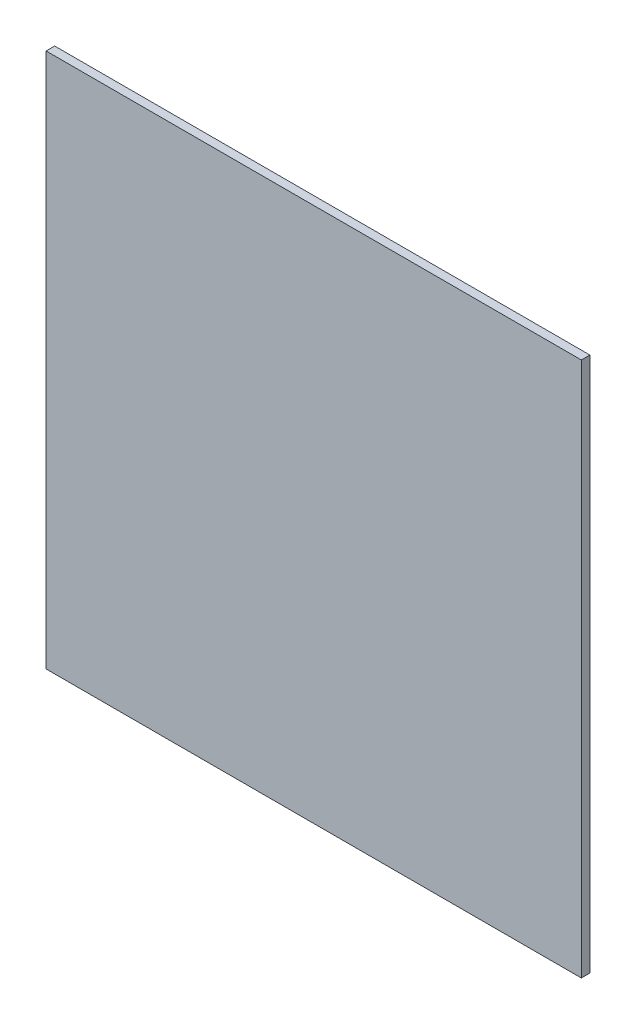
ISO-10303-21;
HEADER;
FILE_DESCRIPTION(('STEP AP214'),'2;1');
FILE_NAME('part.step','',(''),(''),'','','');
FILE_SCHEMA(('AUTOMOTIVE_DESIGN { 1 0 10303 214 1 1 1 1 }'));
ENDSEC;
DATA;
#1=APPLICATION_CONTEXT('core data for automotive mechanical design processes');
#2=APPLICATION_PROTOCOL_DEFINITION('international standard','automotive_design',2000,#1);
#3=PRODUCT_CONTEXT('',#1,'mechanical');
#4=PRODUCT('Part','Part','',(#3));
#5=PRODUCT_RELATED_PRODUCT_CATEGORY('part','',(#4));
#6=PRODUCT_DEFINITION_FORMATION('','',#4);
#7=PRODUCT_DEFINITION_CONTEXT('part definition',#1,'design');
#8=PRODUCT_DEFINITION('design','',#6,#7);
#9=PRODUCT_DEFINITION_SHAPE('','',#8);
#10=(LENGTH_UNIT() NAMED_UNIT(*) SI_UNIT(.MILLI.,.METRE.));
#11=(NAMED_UNIT(*) PLANE_ANGLE_UNIT() SI_UNIT($,.RADIAN.));
#12=(NAMED_UNIT(*) SI_UNIT($,.STERADIAN.) SOLID_ANGLE_UNIT());
#13=UNCERTAINTY_MEASURE_WITH_UNIT(LENGTH_MEASURE(1.E-05),#10,'distance_accuracy_value','');
#14=(GEOMETRIC_REPRESENTATION_CONTEXT(3) GLOBAL_UNCERTAINTY_ASSIGNED_CONTEXT((#13)) GLOBAL_UNIT_ASSIGNED_CONTEXT((#10,
#11,#12)) REPRESENTATION_CONTEXT('',''));
#15=CARTESIAN_POINT('',(0.,0.,0.));
#16=DIRECTION('',(0.,0.,1.));
#17=DIRECTION('',(1.,0.,0.));
#18=AXIS2_PLACEMENT_3D('',#15,#16,#17);
#19=CARTESIAN_POINT('',(0.,0.,1.6));
#20=DIRECTION('',(1.,0.,0.));
#21=DIRECTION('',(0.,1.,0.));
#22=AXIS2_PLACEMENT_3D('',#19,#20,#21);
#23=PLANE('',#22);
#24=DIRECTION('',(0.,-1.,0.));
#25=VECTOR('',#24,1.);
#26=CARTESIAN_POINT('',(0.,0.,0.));
#27=LINE('',#26,#25);
#28=CARTESIAN_POINT('',(0.,0.,0.));
#29=VERTEX_POINT('',#28);
#30=CARTESIAN_POINT('',(0.,-100.,0.));
#31=VERTEX_POINT('',#30);
#32=EDGE_CURVE('E96',#29,#31,#27,.T.);
#33=ORIENTED_EDGE('',*,*,#32,.T.);
#34=DIRECTION('',(0.,0.,-1.));
#35=VECTOR('',#34,1.);
#36=CARTESIAN_POINT('',(0.,-100.,1.6));
#37=LINE('',#36,#35);
#38=CARTESIAN_POINT('',(0.,-100.,1.6));
#39=VERTEX_POINT('',#38);
#40=EDGE_CURVE('E11',#39,#31,#37,.T.);
#41=ORIENTED_EDGE('',*,*,#40,.F.);
#42=DIRECTION('',(0.,-1.,0.));
#43=VECTOR('',#42,1.);
#44=CARTESIAN_POINT('',(0.,0.,1.6));
#45=LINE('',#44,#43);
#46=CARTESIAN_POINT('',(0.,0.,1.6));
#47=VERTEX_POINT('',#46);
#48=EDGE_CURVE('E84',#47,#39,#45,.T.);
#49=ORIENTED_EDGE('',*,*,#48,.F.);
#50=DIRECTION('',(0.,0.,-1.));
#51=VECTOR('',#50,1.);
#52=CARTESIAN_POINT('',(0.,0.,1.6));
#53=LINE('',#52,#51);
#54=EDGE_CURVE('E92',#47,#29,#53,.T.);
#55=ORIENTED_EDGE('',*,*,#54,.T.);
#56=EDGE_LOOP('',(#33,#41,#49,#55));
#57=FACE_BOUND('',#56,.T.);
#58=ADVANCED_FACE('F33',(#57),#23,.F.);
#59=CARTESIAN_POINT('',(0.,-100.,1.6));
#60=DIRECTION('',(0.,1.,0.));
#61=DIRECTION('',(0.,0.,1.));
#62=AXIS2_PLACEMENT_3D('',#59,#60,#61);
#63=PLANE('',#62);
#64=DIRECTION('',(1.,0.,0.));
#65=VECTOR('',#64,1.);
#66=CARTESIAN_POINT('',(0.,-100.,0.));
#67=LINE('',#66,#65);
#68=CARTESIAN_POINT('',(100.,-100.,0.));
#69=VERTEX_POINT('',#68);
#70=EDGE_CURVE('E88',#31,#69,#67,.T.);
#71=ORIENTED_EDGE('',*,*,#70,.T.);
#72=DIRECTION('',(0.,0.,-1.));
#73=VECTOR('',#72,1.);
#74=CARTESIAN_POINT('',(100.,-100.,1.6));
#75=LINE('',#74,#73);
#76=CARTESIAN_POINT('',(100.,-100.,1.6));
#77=VERTEX_POINT('',#76);
#78=EDGE_CURVE('E41',#77,#69,#75,.T.);
#79=ORIENTED_EDGE('',*,*,#78,.F.);
#80=DIRECTION('',(1.,0.,0.));
#81=VECTOR('',#80,1.);
#82=CARTESIAN_POINT('',(0.,-100.,1.6));
#83=LINE('',#82,#81);
#84=EDGE_CURVE('E79',#39,#77,#83,.T.);
#85=ORIENTED_EDGE('',*,*,#84,.F.);
#86=ORIENTED_EDGE('',*,*,#40,.T.);
#87=EDGE_LOOP('',(#71,#79,#85,#86));
#88=FACE_BOUND('',#87,.T.);
#89=ADVANCED_FACE('F87',(#88),#63,.F.);
#90=CARTESIAN_POINT('',(100.,0.,1.6));
#91=DIRECTION('',(-1.,0.,0.));
#92=DIRECTION('',(0.,-1.,0.));
#93=AXIS2_PLACEMENT_3D('',#90,#91,#92);
#94=PLANE('',#93);
#95=DIRECTION('',(0.,1.,0.));
#96=VECTOR('',#95,1.);
#97=CARTESIAN_POINT('',(100.,0.,0.));
#98=LINE('',#97,#96);
#99=CARTESIAN_POINT('',(100.,0.,0.));
#100=VERTEX_POINT('',#99);
#101=EDGE_CURVE('E66',#69,#100,#98,.T.);
#102=ORIENTED_EDGE('',*,*,#101,.T.);
#103=DIRECTION('',(0.,0.,-1.));
#104=VECTOR('',#103,1.);
#105=CARTESIAN_POINT('',(100.,0.,1.6));
#106=LINE('',#105,#104);
#107=CARTESIAN_POINT('',(100.,0.,1.6));
#108=VERTEX_POINT('',#107);
#109=EDGE_CURVE('E89',#108,#100,#106,.T.);
#110=ORIENTED_EDGE('',*,*,#109,.F.);
#111=DIRECTION('',(0.,1.,0.));
#112=VECTOR('',#111,1.);
#113=CARTESIAN_POINT('',(100.,0.,1.6));
#114=LINE('',#113,#112);
#115=EDGE_CURVE('E82',#77,#108,#114,.T.);
#116=ORIENTED_EDGE('',*,*,#115,.F.);
#117=ORIENTED_EDGE('',*,*,#78,.T.);
#118=EDGE_LOOP('',(#102,#110,#116,#117));
#119=FACE_BOUND('',#118,.T.);
#120=ADVANCED_FACE('F90',(#119),#94,.F.);
#121=CARTESIAN_POINT('',(0.,0.,1.6));
#122=DIRECTION('',(0.,-1.,0.));
#123=DIRECTION('',(0.,0.,-1.));
#124=AXIS2_PLACEMENT_3D('',#121,#122,#123);
#125=PLANE('',#124);
#126=DIRECTION('',(-1.,0.,0.));
#127=VECTOR('',#126,1.);
#128=CARTESIAN_POINT('',(0.,0.,0.));
#129=LINE('',#128,#127);
#130=EDGE_CURVE('E72',#100,#29,#129,.T.);
#131=ORIENTED_EDGE('',*,*,#130,.T.);
#132=ORIENTED_EDGE('',*,*,#54,.F.);
#133=DIRECTION('',(-1.,0.,0.));
#134=VECTOR('',#133,1.);
#135=CARTESIAN_POINT('',(0.,0.,1.6));
#136=LINE('',#135,#134);
#137=EDGE_CURVE('E49',#108,#47,#136,.T.);
#138=ORIENTED_EDGE('',*,*,#137,.F.);
#139=ORIENTED_EDGE('',*,*,#109,.T.);
#140=EDGE_LOOP('',(#131,#132,#138,#139));
#141=FACE_BOUND('',#140,.T.);
#142=ADVANCED_FACE('F103',(#141),#125,.F.);
#143=CARTESIAN_POINT('',(0.,-100.,1.6));
#144=DIRECTION('',(0.,0.,1.));
#145=DIRECTION('',(1.,0.,0.));
#146=AXIS2_PLACEMENT_3D('',#143,#144,#145);
#147=PLANE('',#146);
#148=ORIENTED_EDGE('',*,*,#48,.T.);
#149=ORIENTED_EDGE('',*,*,#84,.T.);
#150=ORIENTED_EDGE('',*,*,#115,.T.);
#151=ORIENTED_EDGE('',*,*,#137,.T.);
#152=EDGE_LOOP('',(#148,#149,#150,#151));
#153=FACE_BOUND('',#152,.T.);
#154=ADVANCED_FACE('F80',(#153),#147,.T.);
#155=CARTESIAN_POINT('',(0.,-100.,0.));
#156=DIRECTION('',(0.,0.,1.));
#157=DIRECTION('',(1.,0.,0.));
#158=AXIS2_PLACEMENT_3D('',#155,#156,#157);
#159=PLANE('',#158);
#160=ORIENTED_EDGE('',*,*,#32,.F.);
#161=ORIENTED_EDGE('',*,*,#130,.F.);
#162=ORIENTED_EDGE('',*,*,#101,.F.);
#163=ORIENTED_EDGE('',*,*,#70,.F.);
#164=EDGE_LOOP('',(#160,#161,#162,#163));
#165=FACE_BOUND('',#164,.T.);
#166=ADVANCED_FACE('F106',(#165),#159,.F.);
#167=CLOSED_SHELL('',(#58,#89,#120,#142,#154,#166));
#168=MANIFOLD_SOLID_BREP('B2',#167);
#169=ADVANCED_BREP_SHAPE_REPRESENTATION('',(#18,#168),#14);
#170=SHAPE_DEFINITION_REPRESENTATION(#9,#169);
ENDSEC;
END-ISO-10303-21;
